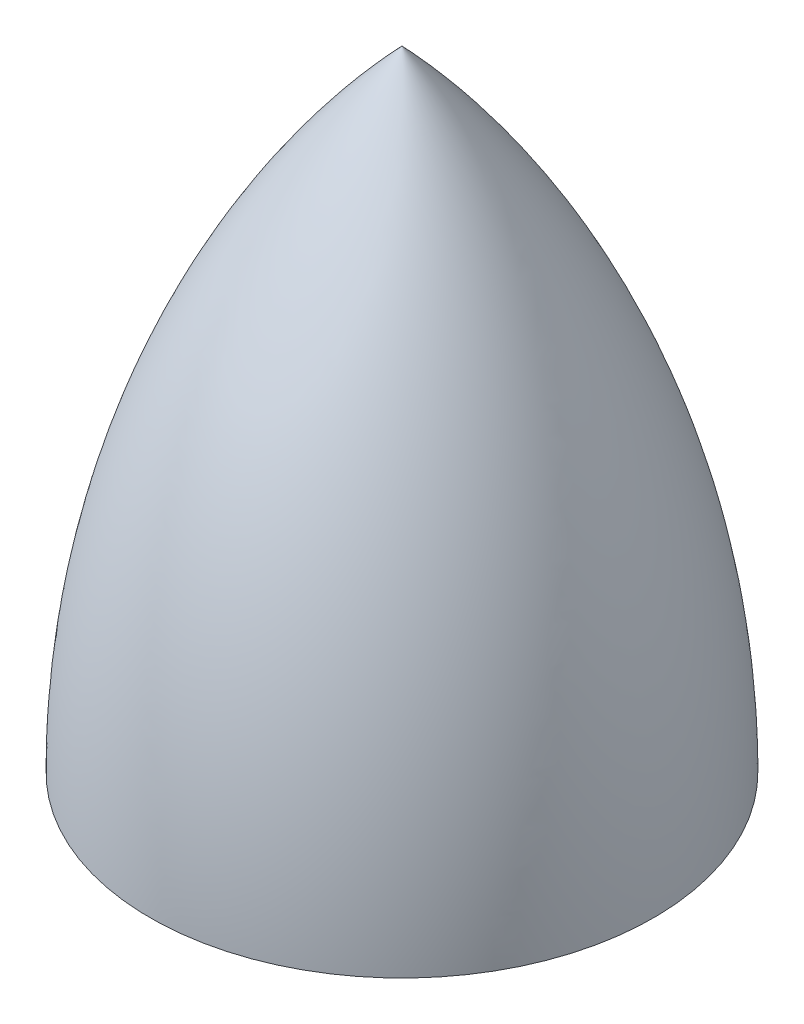
ISO-10303-21;
HEADER;
FILE_DESCRIPTION(('STEP AP214'),'2;1');
FILE_NAME('part.step','',(''),(''),'','','');
FILE_SCHEMA(('AUTOMOTIVE_DESIGN { 1 0 10303 214 1 1 1 1 }'));
ENDSEC;
DATA;
#1=APPLICATION_CONTEXT('core data for automotive mechanical design processes');
#2=APPLICATION_PROTOCOL_DEFINITION('international standard','automotive_design',2000,#1);
#3=PRODUCT_CONTEXT('',#1,'mechanical');
#4=PRODUCT('Part','Part','',(#3));
#5=PRODUCT_RELATED_PRODUCT_CATEGORY('part','',(#4));
#6=PRODUCT_DEFINITION_FORMATION('','',#4);
#7=PRODUCT_DEFINITION_CONTEXT('part definition',#1,'design');
#8=PRODUCT_DEFINITION('design','',#6,#7);
#9=PRODUCT_DEFINITION_SHAPE('','',#8);
#10=(LENGTH_UNIT() NAMED_UNIT(*) SI_UNIT(.MILLI.,.METRE.));
#11=(NAMED_UNIT(*) PLANE_ANGLE_UNIT() SI_UNIT($,.RADIAN.));
#12=(NAMED_UNIT(*) SI_UNIT($,.STERADIAN.) SOLID_ANGLE_UNIT());
#13=UNCERTAINTY_MEASURE_WITH_UNIT(LENGTH_MEASURE(1.E-05),#10,'distance_accuracy_value','');
#14=(GEOMETRIC_REPRESENTATION_CONTEXT(3) GLOBAL_UNCERTAINTY_ASSIGNED_CONTEXT((#13)) GLOBAL_UNIT_ASSIGNED_CONTEXT((#10,
#11,#12)) REPRESENTATION_CONTEXT('',''));
#15=CARTESIAN_POINT('',(0.,0.,0.));
#16=DIRECTION('',(0.,0.,1.));
#17=DIRECTION('',(1.,0.,0.));
#18=AXIS2_PLACEMENT_3D('',#15,#16,#17);
#19=CARTESIAN_POINT('',(0.,0.,0.));
#20=DIRECTION('',(0.,-1.,0.));
#21=DIRECTION('',(0.,0.,-1.));
#22=AXIS2_PLACEMENT_3D('',#19,#20,#21);
#23=PLANE('',#22);
#24=CARTESIAN_POINT('',(0.,0.,0.));
#25=DIRECTION('',(0.,-1.,0.));
#26=DIRECTION('',(0.,0.,-1.));
#27=AXIS2_PLACEMENT_3D('',#24,#25,#26);
#28=CIRCLE('',#27,63.);
#29=CARTESIAN_POINT('',(0.,0.,-63.));
#30=VERTEX_POINT('',#29);
#31=EDGE_CURVE('E44',#30,#30,#28,.T.);
#32=ORIENTED_EDGE('',*,*,#31,.F.);
#33=EDGE_LOOP('',(#32));
#34=FACE_BOUND('',#33,.T.);
#35=CARTESIAN_POINT('',(0.,0.,0.));
#36=DIRECTION('',(0.,-1.,0.));
#37=DIRECTION('',(0.,0.,-1.));
#38=AXIS2_PLACEMENT_3D('',#35,#36,#37);
#39=CIRCLE('',#38,68.);
#40=CARTESIAN_POINT('',(0.,0.,-68.));
#41=VERTEX_POINT('',#40);
#42=EDGE_CURVE('E11',#41,#41,#39,.T.);
#43=ORIENTED_EDGE('',*,*,#42,.T.);
#44=EDGE_LOOP('',(#43));
#45=FACE_BOUND('',#44,.T.);
#46=ADVANCED_FACE('F37',(#34,#45),#23,.T.);
#47=CARTESIAN_POINT('',(0.,0.,178.5));
#48=DIRECTION('',(-1.,0.,0.));
#49=DIRECTION('',(0.,0.,-1.));
#50=AXIS2_PLACEMENT_3D('',#47,#48,#49);
#51=CIRCLE('',#50,246.5);
#52=TRIMMED_CURVE('',#51,(PARAMETER_VALUE(-0.76101275422473)),
(PARAMETER_VALUE(0.76101275422473)),.T.,.PARAMETER.);
#53=CARTESIAN_POINT('',(0.,0.,0.));
#54=DIRECTION('',(0.,-1.,0.));
#55=AXIS1_PLACEMENT('',#53,#54);
#56=SURFACE_OF_REVOLUTION('',#52,#55);
#57=CARTESIAN_POINT('',(0.,170.,0.));
#58=VERTEX_POINT('',#57);
#59=VERTEX_LOOP('',#58);
#60=FACE_BOUND('',#59,.T.);
#61=ORIENTED_EDGE('',*,*,#42,.F.);
#62=EDGE_LOOP('',(#61));
#63=FACE_BOUND('',#62,.T.);
#64=ADVANCED_FACE('F53',(#60,#63),#56,.T.);
#65=CARTESIAN_POINT('',(0.,0.,178.5));
#66=DIRECTION('',(-1.,0.,0.));
#67=DIRECTION('',(0.,0.,-1.));
#68=AXIS2_PLACEMENT_3D('',#65,#66,#67);
#69=CIRCLE('',#68,241.5);
#70=TRIMMED_CURVE('',#69,(PARAMETER_VALUE(-0.739017879013918)),
(PARAMETER_VALUE(0.739017879013918)),.T.,.PARAMETER.);
#71=CARTESIAN_POINT('',(0.,0.,0.));
#72=DIRECTION('',(0.,-1.,0.));
#73=AXIS1_PLACEMENT('',#71,#72);
#74=SURFACE_OF_REVOLUTION('',#70,#73);
#75=CARTESIAN_POINT('',(0.,162.665300540711,0.));
#76=VERTEX_POINT('',#75);
#77=VERTEX_LOOP('',#76);
#78=FACE_BOUND('',#77,.T.);
#79=ORIENTED_EDGE('',*,*,#31,.T.);
#80=EDGE_LOOP('',(#79));
#81=FACE_BOUND('',#80,.T.);
#82=ADVANCED_FACE('F50',(#78,#81),#74,.F.);
#83=CLOSED_SHELL('',(#46,#64,#82));
#84=MANIFOLD_SOLID_BREP('B2',#83);
#85=ADVANCED_BREP_SHAPE_REPRESENTATION('',(#18,#84),#14);
#86=SHAPE_DEFINITION_REPRESENTATION(#9,#85);
ENDSEC;
END-ISO-10303-21;
